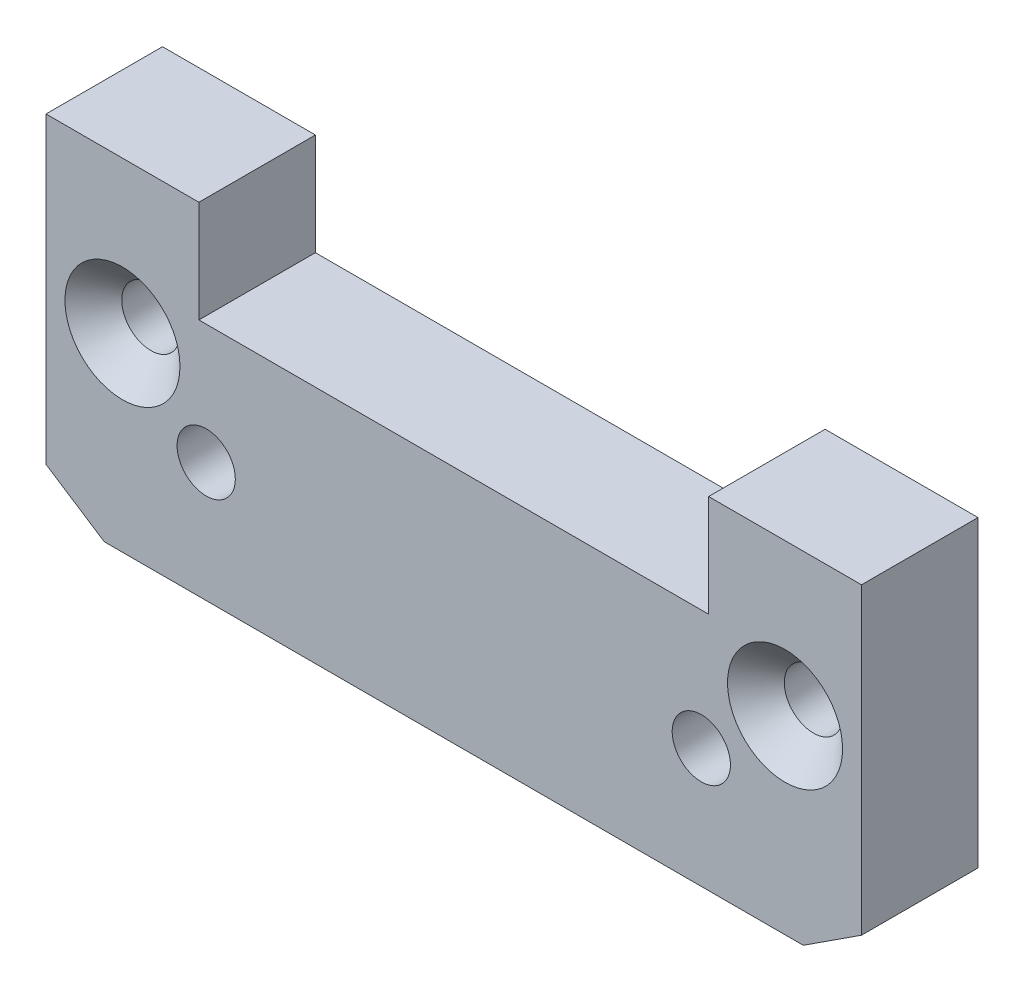
ISO-10303-21;
HEADER;
FILE_DESCRIPTION(('STEP AP214'),'2;1');
FILE_NAME('part.step','',(''),(''),'','','');
FILE_SCHEMA(('AUTOMOTIVE_DESIGN { 1 0 10303 214 1 1 1 1 }'));
ENDSEC;
DATA;
#1=APPLICATION_CONTEXT('core data for automotive mechanical design processes');
#2=APPLICATION_PROTOCOL_DEFINITION('international standard','automotive_design',2000,#1);
#3=PRODUCT_CONTEXT('',#1,'mechanical');
#4=PRODUCT('Part','Part','',(#3));
#5=PRODUCT_RELATED_PRODUCT_CATEGORY('part','',(#4));
#6=PRODUCT_DEFINITION_FORMATION('','',#4);
#7=PRODUCT_DEFINITION_CONTEXT('part definition',#1,'design');
#8=PRODUCT_DEFINITION('design','',#6,#7);
#9=PRODUCT_DEFINITION_SHAPE('','',#8);
#10=(LENGTH_UNIT() NAMED_UNIT(*) SI_UNIT(.MILLI.,.METRE.));
#11=(NAMED_UNIT(*) PLANE_ANGLE_UNIT() SI_UNIT($,.RADIAN.));
#12=(NAMED_UNIT(*) SI_UNIT($,.STERADIAN.) SOLID_ANGLE_UNIT());
#13=UNCERTAINTY_MEASURE_WITH_UNIT(LENGTH_MEASURE(1.E-05),#10,'distance_accuracy_value','');
#14=(GEOMETRIC_REPRESENTATION_CONTEXT(3) GLOBAL_UNCERTAINTY_ASSIGNED_CONTEXT((#13)) GLOBAL_UNIT_ASSIGNED_CONTEXT((#10,
#11,#12)) REPRESENTATION_CONTEXT('',''));
#15=CARTESIAN_POINT('',(0.,0.,0.));
#16=DIRECTION('',(0.,0.,1.));
#17=DIRECTION('',(1.,0.,0.));
#18=AXIS2_PLACEMENT_3D('',#15,#16,#17);
#19=CARTESIAN_POINT('',(0.,0.,0.));
#20=DIRECTION('',(0.,0.,1.));
#21=DIRECTION('',(1.,0.,0.));
#22=AXIS2_PLACEMENT_3D('',#19,#20,#21);
#23=PLANE('',#22);
#24=CARTESIAN_POINT('',(-22.7499999999998,-0.421184813605091,0.));
#25=DIRECTION('',(0.,0.,1.));
#26=DIRECTION('',(1.,0.,0.));
#27=AXIS2_PLACEMENT_3D('',#24,#25,#26);
#28=CIRCLE('',#27,2.);
#29=CARTESIAN_POINT('',(-20.7499999999998,-0.421184813605091,0.));
#30=VERTEX_POINT('',#29);
#31=EDGE_CURVE('E43',#30,#30,#28,.T.);
#32=ORIENTED_EDGE('',*,*,#31,.T.);
#33=EDGE_LOOP('',(#32));
#34=FACE_BOUND('',#33,.T.);
#35=CARTESIAN_POINT('',(22.7500000000003,-0.421184813605091,0.));
#36=DIRECTION('',(0.,0.,1.));
#37=DIRECTION('',(1.,0.,0.));
#38=AXIS2_PLACEMENT_3D('',#35,#36,#37);
#39=CIRCLE('',#38,2.);
#40=CARTESIAN_POINT('',(24.7500000000003,-0.421184813605091,0.));
#41=VERTEX_POINT('',#40);
#42=EDGE_CURVE('E194',#41,#41,#39,.T.);
#43=ORIENTED_EDGE('',*,*,#42,.T.);
#44=EDGE_LOOP('',(#43));
#45=FACE_BOUND('',#44,.T.);
#46=DIRECTION('',(-1.,0.,0.));
#47=VECTOR('',#46,1.);
#48=CARTESIAN_POINT('',(28.0000000000001,10.,0.));
#49=LINE('',#48,#47);
#50=CARTESIAN_POINT('',(28.0000000000001,10.,0.));
#51=VERTEX_POINT('',#50);
#52=CARTESIAN_POINT('',(17.5000000000001,10.,0.));
#53=VERTEX_POINT('',#52);
#54=EDGE_CURVE('E151',#51,#53,#49,.T.);
#55=ORIENTED_EDGE('',*,*,#54,.F.);
#56=DIRECTION('',(0.,1.,0.));
#57=VECTOR('',#56,1.);
#58=CARTESIAN_POINT('',(28.0000000000001,0.,0.));
#59=LINE('',#58,#57);
#60=CARTESIAN_POINT('',(28.,-10.8423696272097,0.));
#61=VERTEX_POINT('',#60);
#62=EDGE_CURVE('E93',#61,#51,#59,.T.);
#63=ORIENTED_EDGE('',*,*,#62,.F.);
#64=DIRECTION('',(0.838670567945428,0.544639035015021,0.));
#65=VECTOR('',#64,1.);
#66=CARTESIAN_POINT('',(23.9999999999998,-13.4399999999999,0.));
#67=LINE('',#66,#65);
#68=CARTESIAN_POINT('',(23.9999999999998,-13.4399999999999,0.));
#69=VERTEX_POINT('',#68);
#70=EDGE_CURVE('E169',#69,#61,#67,.T.);
#71=ORIENTED_EDGE('',*,*,#70,.F.);
#72=DIRECTION('',(1.,0.,0.));
#73=VECTOR('',#72,1.);
#74=CARTESIAN_POINT('',(-24.0000000000002,-13.4399999999999,0.));
#75=LINE('',#74,#73);
#76=CARTESIAN_POINT('',(-24.0000000000002,-13.4399999999999,0.));
#77=VERTEX_POINT('',#76);
#78=EDGE_CURVE('E140',#77,#69,#75,.T.);
#79=ORIENTED_EDGE('',*,*,#78,.F.);
#80=DIRECTION('',(0.838670567945421,-0.544639035015031,0.));
#81=VECTOR('',#80,1.);
#82=CARTESIAN_POINT('',(-28.,-10.84236962721,0.));
#83=LINE('',#82,#81);
#84=CARTESIAN_POINT('',(-28.,-10.84236962721,0.));
#85=VERTEX_POINT('',#84);
#86=EDGE_CURVE('E166',#85,#77,#83,.T.);
#87=ORIENTED_EDGE('',*,*,#86,.F.);
#88=DIRECTION('',(0.,-1.,0.));
#89=VECTOR('',#88,1.);
#90=CARTESIAN_POINT('',(-27.9999999999999,0.,0.));
#91=LINE('',#90,#89);
#92=CARTESIAN_POINT('',(-27.9999999999999,10.,0.));
#93=VERTEX_POINT('',#92);
#94=EDGE_CURVE('E164',#93,#85,#91,.T.);
#95=ORIENTED_EDGE('',*,*,#94,.F.);
#96=DIRECTION('',(-1.,0.,0.));
#97=VECTOR('',#96,1.);
#98=CARTESIAN_POINT('',(-17.4999999999999,10.,0.));
#99=LINE('',#98,#97);
#100=CARTESIAN_POINT('',(-17.4999999999999,10.,0.));
#101=VERTEX_POINT('',#100);
#102=EDGE_CURVE('E161',#101,#93,#99,.T.);
#103=ORIENTED_EDGE('',*,*,#102,.F.);
#104=DIRECTION('',(0.,1.,0.));
#105=VECTOR('',#104,1.);
#106=CARTESIAN_POINT('',(-17.4999999999999,3.0000000000004,0.));
#107=LINE('',#106,#105);
#108=CARTESIAN_POINT('',(-17.4999999999999,3.0000000000004,0.));
#109=VERTEX_POINT('',#108);
#110=EDGE_CURVE('E159',#109,#101,#107,.T.);
#111=ORIENTED_EDGE('',*,*,#110,.F.);
#112=DIRECTION('',(-1.,0.,0.));
#113=VECTOR('',#112,1.);
#114=CARTESIAN_POINT('',(17.5000000000001,3.0000000000004,0.));
#115=LINE('',#114,#113);
#116=CARTESIAN_POINT('',(17.5000000000001,3.0000000000004,0.));
#117=VERTEX_POINT('',#116);
#118=EDGE_CURVE('E157',#117,#109,#115,.T.);
#119=ORIENTED_EDGE('',*,*,#118,.F.);
#120=DIRECTION('',(0.,-1.,0.));
#121=VECTOR('',#120,1.);
#122=CARTESIAN_POINT('',(17.5000000000001,10.,0.));
#123=LINE('',#122,#121);
#124=EDGE_CURVE('E154',#53,#117,#123,.T.);
#125=ORIENTED_EDGE('',*,*,#124,.F.);
#126=EDGE_LOOP('',(#55,#63,#71,#79,#87,#95,#103,#111,#119,#125));
#127=FACE_BOUND('',#126,.T.);
#128=CARTESIAN_POINT('',(16.9999999999998,-5.22,0.));
#129=DIRECTION('',(0.,0.,1.));
#130=DIRECTION('',(1.,0.,0.));
#131=AXIS2_PLACEMENT_3D('',#128,#129,#130);
#132=CIRCLE('',#131,2.);
#133=CARTESIAN_POINT('',(18.9999999999998,-5.22,0.));
#134=VERTEX_POINT('',#133);
#135=EDGE_CURVE('E192',#134,#134,#132,.F.);
#136=ORIENTED_EDGE('',*,*,#135,.F.);
#137=EDGE_LOOP('',(#136));
#138=FACE_BOUND('',#137,.T.);
#139=CARTESIAN_POINT('',(-17.0000000000002,-5.22,0.));
#140=DIRECTION('',(0.,0.,1.));
#141=DIRECTION('',(1.,0.,0.));
#142=AXIS2_PLACEMENT_3D('',#139,#140,#141);
#143=CIRCLE('',#142,2.);
#144=CARTESIAN_POINT('',(-15.0000000000002,-5.22,0.));
#145=VERTEX_POINT('',#144);
#146=EDGE_CURVE('E193',#145,#145,#143,.F.);
#147=ORIENTED_EDGE('',*,*,#146,.F.);
#148=EDGE_LOOP('',(#147));
#149=FACE_BOUND('',#148,.T.);
#150=ADVANCED_FACE('F39',(#34,#45,#127,#138,#149),#23,.F.);
#151=CARTESIAN_POINT('',(28.0000000000001,10.,8.));
#152=DIRECTION('',(0.,-1.,0.));
#153=DIRECTION('',(1.,0.,0.));
#154=AXIS2_PLACEMENT_3D('',#151,#152,#153);
#155=PLANE('',#154);
#156=ORIENTED_EDGE('',*,*,#54,.T.);
#157=DIRECTION('',(0.,0.,-1.));
#158=VECTOR('',#157,1.);
#159=CARTESIAN_POINT('',(17.5000000000001,10.,8.));
#160=LINE('',#159,#158);
#161=CARTESIAN_POINT('',(17.5000000000001,10.,8.));
#162=VERTEX_POINT('',#161);
#163=EDGE_CURVE('E11',#162,#53,#160,.T.);
#164=ORIENTED_EDGE('',*,*,#163,.F.);
#165=DIRECTION('',(-1.,0.,0.));
#166=VECTOR('',#165,1.);
#167=CARTESIAN_POINT('',(28.0000000000001,10.,8.));
#168=LINE('',#167,#166);
#169=CARTESIAN_POINT('',(28.0000000000001,10.,8.));
#170=VERTEX_POINT('',#169);
#171=EDGE_CURVE('E172',#170,#162,#168,.T.);
#172=ORIENTED_EDGE('',*,*,#171,.F.);
#173=DIRECTION('',(0.,0.,-1.));
#174=VECTOR('',#173,1.);
#175=CARTESIAN_POINT('',(28.0000000000001,10.,8.));
#176=LINE('',#175,#174);
#177=EDGE_CURVE('E147',#170,#51,#176,.T.);
#178=ORIENTED_EDGE('',*,*,#177,.T.);
#179=EDGE_LOOP('',(#156,#164,#172,#178));
#180=FACE_BOUND('',#179,.T.);
#181=ADVANCED_FACE('F41',(#180),#155,.F.);
#182=CARTESIAN_POINT('',(17.5000000000001,10.,8.));
#183=DIRECTION('',(1.,0.,0.));
#184=DIRECTION('',(0.,0.,-1.));
#185=AXIS2_PLACEMENT_3D('',#182,#183,#184);
#186=PLANE('',#185);
#187=ORIENTED_EDGE('',*,*,#124,.T.);
#188=DIRECTION('',(0.,0.,-1.));
#189=VECTOR('',#188,1.);
#190=CARTESIAN_POINT('',(17.5000000000001,3.0000000000004,8.));
#191=LINE('',#190,#189);
#192=CARTESIAN_POINT('',(17.5000000000001,3.0000000000004,8.));
#193=VERTEX_POINT('',#192);
#194=EDGE_CURVE('E49',#193,#117,#191,.T.);
#195=ORIENTED_EDGE('',*,*,#194,.F.);
#196=DIRECTION('',(0.,-1.,0.));
#197=VECTOR('',#196,1.);
#198=CARTESIAN_POINT('',(17.5000000000001,10.,8.));
#199=LINE('',#198,#197);
#200=EDGE_CURVE('E105',#162,#193,#199,.T.);
#201=ORIENTED_EDGE('',*,*,#200,.F.);
#202=ORIENTED_EDGE('',*,*,#163,.T.);
#203=EDGE_LOOP('',(#187,#195,#201,#202));
#204=FACE_BOUND('',#203,.T.);
#205=ADVANCED_FACE('F239',(#204),#186,.F.);
#206=CARTESIAN_POINT('',(17.5000000000001,3.0000000000004,8.));
#207=DIRECTION('',(0.,-1.,0.));
#208=DIRECTION('',(0.,0.,-1.));
#209=AXIS2_PLACEMENT_3D('',#206,#207,#208);
#210=PLANE('',#209);
#211=ORIENTED_EDGE('',*,*,#118,.T.);
#212=DIRECTION('',(0.,0.,-1.));
#213=VECTOR('',#212,1.);
#214=CARTESIAN_POINT('',(-17.4999999999999,3.0000000000004,8.));
#215=LINE('',#214,#213);
#216=CARTESIAN_POINT('',(-17.4999999999999,3.0000000000004,8.));
#217=VERTEX_POINT('',#216);
#218=EDGE_CURVE('E185',#217,#109,#215,.T.);
#219=ORIENTED_EDGE('',*,*,#218,.F.);
#220=DIRECTION('',(-1.,0.,0.));
#221=VECTOR('',#220,1.);
#222=CARTESIAN_POINT('',(17.5000000000001,3.0000000000004,8.));
#223=LINE('',#222,#221);
#224=EDGE_CURVE('E216',#193,#217,#223,.T.);
#225=ORIENTED_EDGE('',*,*,#224,.F.);
#226=ORIENTED_EDGE('',*,*,#194,.T.);
#227=EDGE_LOOP('',(#211,#219,#225,#226));
#228=FACE_BOUND('',#227,.T.);
#229=ADVANCED_FACE('F242',(#228),#210,.F.);
#230=CARTESIAN_POINT('',(-17.4999999999999,3.0000000000004,8.));
#231=DIRECTION('',(-1.,0.,0.));
#232=DIRECTION('',(0.,0.,1.));
#233=AXIS2_PLACEMENT_3D('',#230,#231,#232);
#234=PLANE('',#233);
#235=ORIENTED_EDGE('',*,*,#110,.T.);
#236=DIRECTION('',(0.,0.,-1.));
#237=VECTOR('',#236,1.);
#238=CARTESIAN_POINT('',(-17.4999999999999,10.,8.));
#239=LINE('',#238,#237);
#240=CARTESIAN_POINT('',(-17.4999999999999,10.,8.));
#241=VERTEX_POINT('',#240);
#242=EDGE_CURVE('E182',#241,#101,#239,.T.);
#243=ORIENTED_EDGE('',*,*,#242,.F.);
#244=DIRECTION('',(0.,1.,0.));
#245=VECTOR('',#244,1.);
#246=CARTESIAN_POINT('',(-17.4999999999999,3.0000000000004,8.));
#247=LINE('',#246,#245);
#248=EDGE_CURVE('E218',#217,#241,#247,.T.);
#249=ORIENTED_EDGE('',*,*,#248,.F.);
#250=ORIENTED_EDGE('',*,*,#218,.T.);
#251=EDGE_LOOP('',(#235,#243,#249,#250));
#252=FACE_BOUND('',#251,.T.);
#253=ADVANCED_FACE('F247',(#252),#234,.F.);
#254=CARTESIAN_POINT('',(-17.4999999999999,10.,8.));
#255=DIRECTION('',(0.,-1.,0.));
#256=DIRECTION('',(1.,0.,0.));
#257=AXIS2_PLACEMENT_3D('',#254,#255,#256);
#258=PLANE('',#257);
#259=ORIENTED_EDGE('',*,*,#102,.T.);
#260=DIRECTION('',(0.,0.,-1.));
#261=VECTOR('',#260,1.);
#262=CARTESIAN_POINT('',(-27.9999999999999,10.,8.));
#263=LINE('',#262,#261);
#264=CARTESIAN_POINT('',(-27.9999999999999,10.,8.));
#265=VERTEX_POINT('',#264);
#266=EDGE_CURVE('E179',#265,#93,#263,.T.);
#267=ORIENTED_EDGE('',*,*,#266,.F.);
#268=DIRECTION('',(-1.,0.,0.));
#269=VECTOR('',#268,1.);
#270=CARTESIAN_POINT('',(-17.4999999999999,10.,8.));
#271=LINE('',#270,#269);
#272=EDGE_CURVE('E220',#241,#265,#271,.T.);
#273=ORIENTED_EDGE('',*,*,#272,.F.);
#274=ORIENTED_EDGE('',*,*,#242,.T.);
#275=EDGE_LOOP('',(#259,#267,#273,#274));
#276=FACE_BOUND('',#275,.T.);
#277=ADVANCED_FACE('F250',(#276),#258,.F.);
#278=CARTESIAN_POINT('',(-27.9999999999999,0.,8.));
#279=DIRECTION('',(1.,0.,0.));
#280=DIRECTION('',(0.,1.,0.));
#281=AXIS2_PLACEMENT_3D('',#278,#279,#280);
#282=PLANE('',#281);
#283=ORIENTED_EDGE('',*,*,#94,.T.);
#284=DIRECTION('',(0.,0.,-1.));
#285=VECTOR('',#284,1.);
#286=CARTESIAN_POINT('',(-28.,-10.84236962721,8.));
#287=LINE('',#286,#285);
#288=CARTESIAN_POINT('',(-28.,-10.84236962721,8.));
#289=VERTEX_POINT('',#288);
#290=EDGE_CURVE('E176',#289,#85,#287,.T.);
#291=ORIENTED_EDGE('',*,*,#290,.F.);
#292=DIRECTION('',(0.,-1.,0.));
#293=VECTOR('',#292,1.);
#294=CARTESIAN_POINT('',(-27.9999999999999,0.,8.));
#295=LINE('',#294,#293);
#296=EDGE_CURVE('E222',#265,#289,#295,.T.);
#297=ORIENTED_EDGE('',*,*,#296,.F.);
#298=ORIENTED_EDGE('',*,*,#266,.T.);
#299=EDGE_LOOP('',(#283,#291,#297,#298));
#300=FACE_BOUND('',#299,.T.);
#301=ADVANCED_FACE('F228',(#300),#282,.F.);
#302=CARTESIAN_POINT('',(-28.,-10.84236962721,8.));
#303=DIRECTION('',(0.544639035015031,0.838670567945422,0.));
#304=DIRECTION('',(-0.838670567945421,0.544639035015031,0.));
#305=AXIS2_PLACEMENT_3D('',#302,#303,#304);
#306=PLANE('',#305);
#307=ORIENTED_EDGE('',*,*,#86,.T.);
#308=DIRECTION('',(0.,0.,-1.));
#309=VECTOR('',#308,1.);
#310=CARTESIAN_POINT('',(-24.0000000000002,-13.4399999999999,8.));
#311=LINE('',#310,#309);
#312=CARTESIAN_POINT('',(-24.0000000000002,-13.4399999999999,8.));
#313=VERTEX_POINT('',#312);
#314=EDGE_CURVE('E142',#313,#77,#311,.T.);
#315=ORIENTED_EDGE('',*,*,#314,.F.);
#316=DIRECTION('',(0.838670567945421,-0.544639035015031,0.));
#317=VECTOR('',#316,1.);
#318=CARTESIAN_POINT('',(-28.,-10.84236962721,8.));
#319=LINE('',#318,#317);
#320=EDGE_CURVE('E131',#289,#313,#319,.T.);
#321=ORIENTED_EDGE('',*,*,#320,.F.);
#322=ORIENTED_EDGE('',*,*,#290,.T.);
#323=EDGE_LOOP('',(#307,#315,#321,#322));
#324=FACE_BOUND('',#323,.T.);
#325=ADVANCED_FACE('F231',(#324),#306,.F.);
#326=CARTESIAN_POINT('',(-24.0000000000002,-13.4399999999999,8.));
#327=DIRECTION('',(0.,1.,0.));
#328=DIRECTION('',(0.,0.,1.));
#329=AXIS2_PLACEMENT_3D('',#326,#327,#328);
#330=PLANE('',#329);
#331=ORIENTED_EDGE('',*,*,#78,.T.);
#332=DIRECTION('',(0.,0.,-1.));
#333=VECTOR('',#332,1.);
#334=CARTESIAN_POINT('',(23.9999999999998,-13.4399999999999,8.));
#335=LINE('',#334,#333);
#336=CARTESIAN_POINT('',(23.9999999999998,-13.4399999999999,8.));
#337=VERTEX_POINT('',#336);
#338=EDGE_CURVE('E137',#337,#69,#335,.T.);
#339=ORIENTED_EDGE('',*,*,#338,.F.);
#340=DIRECTION('',(1.,0.,0.));
#341=VECTOR('',#340,1.);
#342=CARTESIAN_POINT('',(-24.0000000000002,-13.4399999999999,8.));
#343=LINE('',#342,#341);
#344=EDGE_CURVE('E124',#313,#337,#343,.T.);
#345=ORIENTED_EDGE('',*,*,#344,.F.);
#346=ORIENTED_EDGE('',*,*,#314,.T.);
#347=EDGE_LOOP('',(#331,#339,#345,#346));
#348=FACE_BOUND('',#347,.T.);
#349=ADVANCED_FACE('F138',(#348),#330,.F.);
#350=CARTESIAN_POINT('',(23.9999999999998,-13.4399999999999,8.));
#351=DIRECTION('',(-0.544639035015021,0.838670567945428,0.));
#352=DIRECTION('',(-0.838670567945428,-0.544639035015021,0.));
#353=AXIS2_PLACEMENT_3D('',#350,#351,#352);
#354=PLANE('',#353);
#355=ORIENTED_EDGE('',*,*,#70,.T.);
#356=DIRECTION('',(0.,0.,-1.));
#357=VECTOR('',#356,1.);
#358=CARTESIAN_POINT('',(28.,-10.8423696272097,8.));
#359=LINE('',#358,#357);
#360=CARTESIAN_POINT('',(28.,-10.8423696272097,8.));
#361=VERTEX_POINT('',#360);
#362=EDGE_CURVE('E143',#361,#61,#359,.T.);
#363=ORIENTED_EDGE('',*,*,#362,.F.);
#364=DIRECTION('',(0.838670567945428,0.544639035015021,0.));
#365=VECTOR('',#364,1.);
#366=CARTESIAN_POINT('',(23.9999999999998,-13.4399999999999,8.));
#367=LINE('',#366,#365);
#368=EDGE_CURVE('E128',#337,#361,#367,.T.);
#369=ORIENTED_EDGE('',*,*,#368,.F.);
#370=ORIENTED_EDGE('',*,*,#338,.T.);
#371=EDGE_LOOP('',(#355,#363,#369,#370));
#372=FACE_BOUND('',#371,.T.);
#373=ADVANCED_FACE('F145',(#372),#354,.F.);
#374=CARTESIAN_POINT('',(28.0000000000001,0.,8.));
#375=DIRECTION('',(-1.,0.,0.));
#376=DIRECTION('',(0.,-1.,0.));
#377=AXIS2_PLACEMENT_3D('',#374,#375,#376);
#378=PLANE('',#377);
#379=ORIENTED_EDGE('',*,*,#62,.T.);
#380=ORIENTED_EDGE('',*,*,#177,.F.);
#381=DIRECTION('',(0.,1.,0.));
#382=VECTOR('',#381,1.);
#383=CARTESIAN_POINT('',(28.,-10.8423696272097,8.));
#384=LINE('',#383,#382);
#385=EDGE_CURVE('E58',#361,#170,#384,.T.);
#386=ORIENTED_EDGE('',*,*,#385,.F.);
#387=ORIENTED_EDGE('',*,*,#362,.T.);
#388=EDGE_LOOP('',(#379,#380,#386,#387));
#389=FACE_BOUND('',#388,.T.);
#390=ADVANCED_FACE('F233',(#389),#378,.F.);
#391=CARTESIAN_POINT('',(0.,0.,8.));
#392=DIRECTION('',(0.,0.,1.));
#393=DIRECTION('',(1.,0.,0.));
#394=AXIS2_PLACEMENT_3D('',#391,#392,#393);
#395=PLANE('',#394);
#396=CARTESIAN_POINT('',(-22.7499999999998,-0.421184813605091,8.00000000000001));
#397=DIRECTION('',(0.,0.,1.));
#398=DIRECTION('',(1.,0.,0.));
#399=AXIS2_PLACEMENT_3D('',#396,#397,#398);
#400=CIRCLE('',#399,3.95);
#401=CARTESIAN_POINT('',(-18.7999999999998,-0.421184813605091,8.00000000000001));
#402=VERTEX_POINT('',#401);
#403=EDGE_CURVE('E363',#402,#402,#400,.T.);
#404=ORIENTED_EDGE('',*,*,#403,.F.);
#405=EDGE_LOOP('',(#404));
#406=FACE_BOUND('',#405,.T.);
#407=CARTESIAN_POINT('',(22.7500000000003,-0.421184813605091,8.00000000000001));
#408=DIRECTION('',(0.,0.,1.));
#409=DIRECTION('',(1.,0.,0.));
#410=AXIS2_PLACEMENT_3D('',#407,#408,#409);
#411=CIRCLE('',#410,3.95);
#412=CARTESIAN_POINT('',(26.7000000000003,-0.421184813605091,8.00000000000001));
#413=VERTEX_POINT('',#412);
#414=EDGE_CURVE('E202',#413,#413,#411,.T.);
#415=ORIENTED_EDGE('',*,*,#414,.F.);
#416=EDGE_LOOP('',(#415));
#417=FACE_BOUND('',#416,.T.);
#418=CARTESIAN_POINT('',(-17.0000000000002,-5.22,8.));
#419=DIRECTION('',(0.,0.,1.));
#420=DIRECTION('',(1.,0.,0.));
#421=AXIS2_PLACEMENT_3D('',#418,#419,#420);
#422=CIRCLE('',#421,2.);
#423=CARTESIAN_POINT('',(-15.0000000000002,-5.22,8.));
#424=VERTEX_POINT('',#423);
#425=EDGE_CURVE('E190',#424,#424,#422,.T.);
#426=ORIENTED_EDGE('',*,*,#425,.F.);
#427=EDGE_LOOP('',(#426));
#428=FACE_BOUND('',#427,.T.);
#429=CARTESIAN_POINT('',(16.9999999999998,-5.22,8.));
#430=DIRECTION('',(0.,0.,1.));
#431=DIRECTION('',(1.,0.,0.));
#432=AXIS2_PLACEMENT_3D('',#429,#430,#431);
#433=CIRCLE('',#432,2.);
#434=CARTESIAN_POINT('',(18.9999999999998,-5.22,8.));
#435=VERTEX_POINT('',#434);
#436=EDGE_CURVE('E155',#435,#435,#433,.T.);
#437=ORIENTED_EDGE('',*,*,#436,.F.);
#438=EDGE_LOOP('',(#437));
#439=FACE_BOUND('',#438,.T.);
#440=ORIENTED_EDGE('',*,*,#171,.T.);
#441=ORIENTED_EDGE('',*,*,#200,.T.);
#442=ORIENTED_EDGE('',*,*,#224,.T.);
#443=ORIENTED_EDGE('',*,*,#248,.T.);
#444=ORIENTED_EDGE('',*,*,#272,.T.);
#445=ORIENTED_EDGE('',*,*,#296,.T.);
#446=ORIENTED_EDGE('',*,*,#320,.T.);
#447=ORIENTED_EDGE('',*,*,#344,.T.);
#448=ORIENTED_EDGE('',*,*,#368,.T.);
#449=ORIENTED_EDGE('',*,*,#385,.T.);
#450=EDGE_LOOP('',(#440,#441,#442,#443,#444,#445,#446,#447,#448,#449));
#451=FACE_BOUND('',#450,.T.);
#452=ADVANCED_FACE('F126',(#406,#417,#428,#439,#451),#395,.T.);
#453=CARTESIAN_POINT('',(16.9999999999998,-5.22,12.9999999999999));
#454=DIRECTION('',(0.,0.,1.));
#455=DIRECTION('',(1.,0.,0.));
#456=AXIS2_PLACEMENT_3D('',#453,#454,#455);
#457=CYLINDRICAL_SURFACE('',#456,2.);
#458=ORIENTED_EDGE('',*,*,#436,.T.);
#459=EDGE_LOOP('',(#458));
#460=FACE_BOUND('',#459,.T.);
#461=ORIENTED_EDGE('',*,*,#135,.T.);
#462=EDGE_LOOP('',(#461));
#463=FACE_BOUND('',#462,.T.);
#464=ADVANCED_FACE('F302',(#460,#463),#457,.F.);
#465=CARTESIAN_POINT('',(-17.0000000000002,-5.22,12.9999999999999));
#466=DIRECTION('',(0.,0.,1.));
#467=DIRECTION('',(1.,0.,0.));
#468=AXIS2_PLACEMENT_3D('',#465,#466,#467);
#469=CYLINDRICAL_SURFACE('',#468,2.);
#470=ORIENTED_EDGE('',*,*,#425,.T.);
#471=EDGE_LOOP('',(#470));
#472=FACE_BOUND('',#471,.T.);
#473=ORIENTED_EDGE('',*,*,#146,.T.);
#474=EDGE_LOOP('',(#473));
#475=FACE_BOUND('',#474,.T.);
#476=ADVANCED_FACE('F305',(#472,#475),#469,.F.);
#477=CARTESIAN_POINT('',(22.7500000000003,-0.421184813605091,8.00000000000001));
#478=DIRECTION('',(0.,0.,1.));
#479=DIRECTION('',(1.,0.,0.));
#480=AXIS2_PLACEMENT_3D('',#477,#478,#479);
#481=CYLINDRICAL_SURFACE('',#480,2.);
#482=CARTESIAN_POINT('',(22.7500000000003,-0.421184813605091,6.05000000000001));
#483=DIRECTION('',(0.,0.,1.));
#484=DIRECTION('',(1.,0.,0.));
#485=AXIS2_PLACEMENT_3D('',#482,#483,#484);
#486=CIRCLE('',#485,2.);
#487=CARTESIAN_POINT('',(24.7500000000003,-0.421184813605091,6.05000000000001));
#488=VERTEX_POINT('',#487);
#489=EDGE_CURVE('E196',#488,#488,#486,.T.);
#490=ORIENTED_EDGE('',*,*,#489,.T.);
#491=EDGE_LOOP('',(#490));
#492=FACE_BOUND('',#491,.T.);
#493=ORIENTED_EDGE('',*,*,#42,.F.);
#494=EDGE_LOOP('',(#493));
#495=FACE_BOUND('',#494,.T.);
#496=ADVANCED_FACE('F312',(#492,#495),#481,.F.);
#497=CARTESIAN_POINT('',(22.7500000000003,-0.421184813605091,8.00000000000001));
#498=DIRECTION('',(0.,0.,1.));
#499=DIRECTION('',(1.,0.,0.));
#500=AXIS2_PLACEMENT_3D('',#497,#498,#499);
#501=CONICAL_SURFACE('',#500,3.95,0.785398163397449);
#502=ORIENTED_EDGE('',*,*,#489,.F.);
#503=EDGE_LOOP('',(#502));
#504=FACE_BOUND('',#503,.T.);
#505=ORIENTED_EDGE('',*,*,#414,.T.);
#506=EDGE_LOOP('',(#505));
#507=FACE_BOUND('',#506,.T.);
#508=ADVANCED_FACE('F325',(#504,#507),#501,.F.);
#509=CARTESIAN_POINT('',(-22.7499999999998,-0.421184813605091,8.00000000000001));
#510=DIRECTION('',(0.,0.,1.));
#511=DIRECTION('',(1.,0.,0.));
#512=AXIS2_PLACEMENT_3D('',#509,#510,#511);
#513=CYLINDRICAL_SURFACE('',#512,2.);
#514=CARTESIAN_POINT('',(-22.7499999999998,-0.421184813605091,6.05000000000001));
#515=DIRECTION('',(0.,0.,1.));
#516=DIRECTION('',(1.,0.,0.));
#517=AXIS2_PLACEMENT_3D('',#514,#515,#516);
#518=CIRCLE('',#517,2.);
#519=CARTESIAN_POINT('',(-20.7499999999998,-0.421184813605091,6.05000000000001));
#520=VERTEX_POINT('',#519);
#521=EDGE_CURVE('E360',#520,#520,#518,.T.);
#522=ORIENTED_EDGE('',*,*,#521,.T.);
#523=EDGE_LOOP('',(#522));
#524=FACE_BOUND('',#523,.T.);
#525=ORIENTED_EDGE('',*,*,#31,.F.);
#526=EDGE_LOOP('',(#525));
#527=FACE_BOUND('',#526,.T.);
#528=ADVANCED_FACE('F334',(#524,#527),#513,.F.);
#529=CARTESIAN_POINT('',(-22.7499999999998,-0.421184813605091,8.00000000000001));
#530=DIRECTION('',(0.,0.,1.));
#531=DIRECTION('',(1.,0.,0.));
#532=AXIS2_PLACEMENT_3D('',#529,#530,#531);
#533=CONICAL_SURFACE('',#532,3.95,0.785398163397449);
#534=ORIENTED_EDGE('',*,*,#521,.F.);
#535=EDGE_LOOP('',(#534));
#536=FACE_BOUND('',#535,.T.);
#537=ORIENTED_EDGE('',*,*,#403,.T.);
#538=EDGE_LOOP('',(#537));
#539=FACE_BOUND('',#538,.T.);
#540=ADVANCED_FACE('F344',(#536,#539),#533,.F.);
#541=CLOSED_SHELL('',(#150,#181,#205,#229,#253,#277,#301,#325,#349,#373,#390,#452,#464,#476,
#496,#508,#528,#540));
#542=MANIFOLD_SOLID_BREP('B2',#541);
#543=ADVANCED_BREP_SHAPE_REPRESENTATION('',(#18,#542),#14);
#544=SHAPE_DEFINITION_REPRESENTATION(#9,#543);
ENDSEC;
END-ISO-10303-21;
